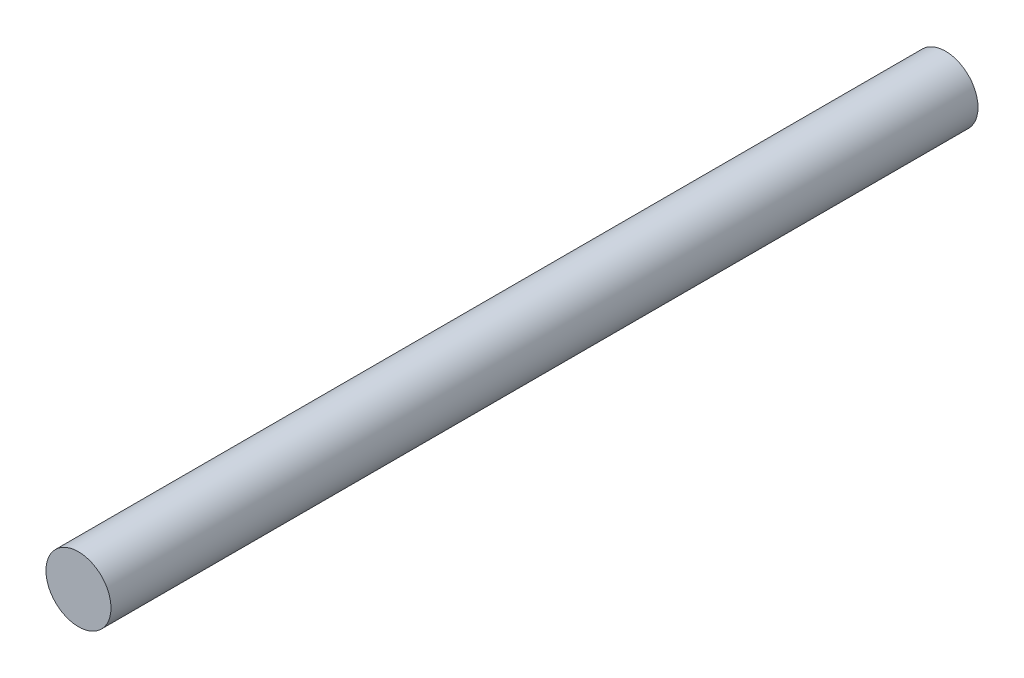
ISO-10303-21;
HEADER;
FILE_DESCRIPTION(('STEP AP214'),'2;1');
FILE_NAME('part.step','',(''),(''),'','','');
FILE_SCHEMA(('AUTOMOTIVE_DESIGN { 1 0 10303 214 1 1 1 1 }'));
ENDSEC;
DATA;
#1=APPLICATION_CONTEXT('core data for automotive mechanical design processes');
#2=APPLICATION_PROTOCOL_DEFINITION('international standard','automotive_design',2000,#1);
#3=PRODUCT_CONTEXT('',#1,'mechanical');
#4=PRODUCT('Part','Part','',(#3));
#5=PRODUCT_RELATED_PRODUCT_CATEGORY('part','',(#4));
#6=PRODUCT_DEFINITION_FORMATION('','',#4);
#7=PRODUCT_DEFINITION_CONTEXT('part definition',#1,'design');
#8=PRODUCT_DEFINITION('design','',#6,#7);
#9=PRODUCT_DEFINITION_SHAPE('','',#8);
#10=(LENGTH_UNIT() NAMED_UNIT(*) SI_UNIT(.MILLI.,.METRE.));
#11=(NAMED_UNIT(*) PLANE_ANGLE_UNIT() SI_UNIT($,.RADIAN.));
#12=(NAMED_UNIT(*) SI_UNIT($,.STERADIAN.) SOLID_ANGLE_UNIT());
#13=UNCERTAINTY_MEASURE_WITH_UNIT(LENGTH_MEASURE(1.E-05),#10,'distance_accuracy_value','');
#14=(GEOMETRIC_REPRESENTATION_CONTEXT(3) GLOBAL_UNCERTAINTY_ASSIGNED_CONTEXT((#13)) GLOBAL_UNIT_ASSIGNED_CONTEXT((#10,
#11,#12)) REPRESENTATION_CONTEXT('',''));
#15=CARTESIAN_POINT('',(0.,0.,0.));
#16=DIRECTION('',(0.,0.,1.));
#17=DIRECTION('',(1.,0.,0.));
#18=AXIS2_PLACEMENT_3D('',#15,#16,#17);
#19=CARTESIAN_POINT('',(0.,0.,40.));
#20=DIRECTION('',(0.,0.,-1.));
#21=DIRECTION('',(-1.,0.,0.));
#22=AXIS2_PLACEMENT_3D('',#19,#20,#21);
#23=CYLINDRICAL_SURFACE('',#22,1.5);
#24=CARTESIAN_POINT('',(0.,0.,40.));
#25=DIRECTION('',(0.,0.,1.));
#26=DIRECTION('',(1.,0.,0.));
#27=AXIS2_PLACEMENT_3D('',#24,#25,#26);
#28=CIRCLE('',#27,1.5);
#29=CARTESIAN_POINT('',(1.5,0.,40.));
#30=VERTEX_POINT('',#29);
#31=EDGE_CURVE('E10',#30,#30,#28,.T.);
#32=ORIENTED_EDGE('',*,*,#31,.F.);
#33=EDGE_LOOP('',(#32));
#34=FACE_BOUND('',#33,.T.);
#35=CARTESIAN_POINT('',(0.,0.,0.));
#36=DIRECTION('',(0.,0.,1.));
#37=DIRECTION('',(1.,0.,0.));
#38=AXIS2_PLACEMENT_3D('',#35,#36,#37);
#39=CIRCLE('',#38,1.5);
#40=CARTESIAN_POINT('',(1.5,0.,0.));
#41=VERTEX_POINT('',#40);
#42=EDGE_CURVE('E36',#41,#41,#39,.T.);
#43=ORIENTED_EDGE('',*,*,#42,.T.);
#44=EDGE_LOOP('',(#43));
#45=FACE_BOUND('',#44,.T.);
#46=ADVANCED_FACE('F33',(#34,#45),#23,.T.);
#47=CARTESIAN_POINT('',(0.,0.,40.));
#48=DIRECTION('',(0.,0.,1.));
#49=DIRECTION('',(1.,0.,0.));
#50=AXIS2_PLACEMENT_3D('',#47,#48,#49);
#51=PLANE('',#50);
#52=ORIENTED_EDGE('',*,*,#31,.T.);
#53=EDGE_LOOP('',(#52));
#54=FACE_BOUND('',#53,.T.);
#55=ADVANCED_FACE('F48',(#54),#51,.T.);
#56=CARTESIAN_POINT('',(0.,0.,0.));
#57=DIRECTION('',(0.,0.,1.));
#58=DIRECTION('',(1.,0.,0.));
#59=AXIS2_PLACEMENT_3D('',#56,#57,#58);
#60=PLANE('',#59);
#61=ORIENTED_EDGE('',*,*,#42,.F.);
#62=EDGE_LOOP('',(#61));
#63=FACE_BOUND('',#62,.T.);
#64=ADVANCED_FACE('F46',(#63),#60,.F.);
#65=CLOSED_SHELL('',(#46,#55,#64));
#66=MANIFOLD_SOLID_BREP('B2',#65);
#67=ADVANCED_BREP_SHAPE_REPRESENTATION('',(#18,#66),#14);
#68=SHAPE_DEFINITION_REPRESENTATION(#9,#67);
ENDSEC;
END-ISO-10303-21;
